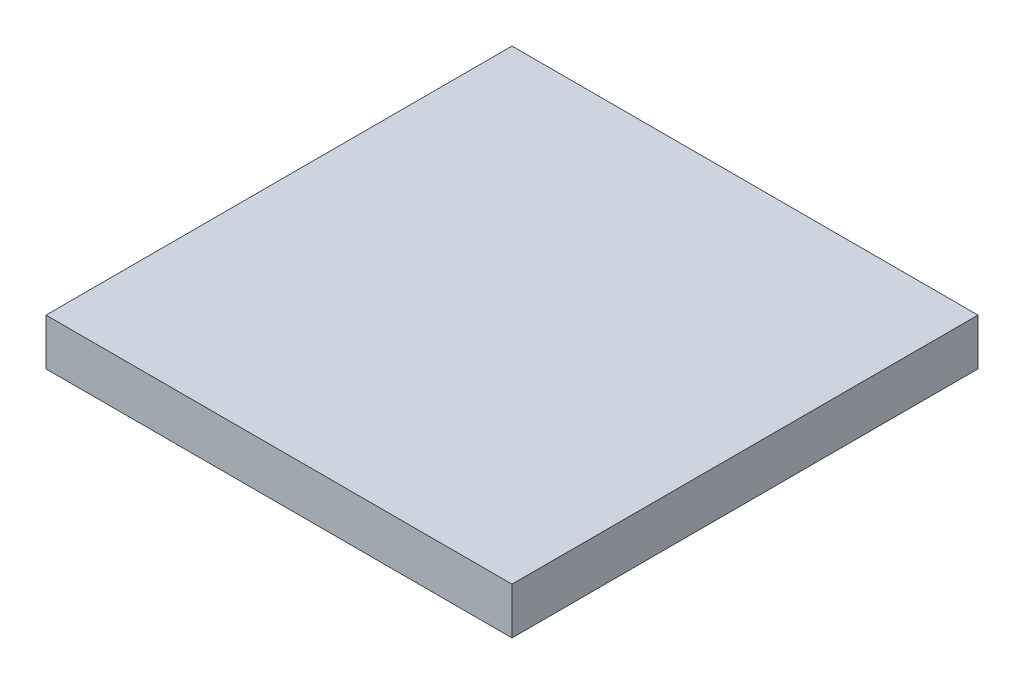
ISO-10303-21;
HEADER;
FILE_DESCRIPTION(('STEP AP214'),'2;1');
FILE_NAME('part.step','',(''),(''),'','','');
FILE_SCHEMA(('AUTOMOTIVE_DESIGN { 1 0 10303 214 1 1 1 1 }'));
ENDSEC;
DATA;
#1=APPLICATION_CONTEXT('core data for automotive mechanical design processes');
#2=APPLICATION_PROTOCOL_DEFINITION('international standard','automotive_design',2000,#1);
#3=PRODUCT_CONTEXT('',#1,'mechanical');
#4=PRODUCT('Part','Part','',(#3));
#5=PRODUCT_RELATED_PRODUCT_CATEGORY('part','',(#4));
#6=PRODUCT_DEFINITION_FORMATION('','',#4);
#7=PRODUCT_DEFINITION_CONTEXT('part definition',#1,'design');
#8=PRODUCT_DEFINITION('design','',#6,#7);
#9=PRODUCT_DEFINITION_SHAPE('','',#8);
#10=(LENGTH_UNIT() NAMED_UNIT(*) SI_UNIT(.MILLI.,.METRE.));
#11=(NAMED_UNIT(*) PLANE_ANGLE_UNIT() SI_UNIT($,.RADIAN.));
#12=(NAMED_UNIT(*) SI_UNIT($,.STERADIAN.) SOLID_ANGLE_UNIT());
#13=UNCERTAINTY_MEASURE_WITH_UNIT(LENGTH_MEASURE(1.E-05),#10,'distance_accuracy_value','');
#14=(GEOMETRIC_REPRESENTATION_CONTEXT(3) GLOBAL_UNCERTAINTY_ASSIGNED_CONTEXT((#13)) GLOBAL_UNIT_ASSIGNED_CONTEXT((#10,
#11,#12)) REPRESENTATION_CONTEXT('',''));
#15=CARTESIAN_POINT('',(0.,0.,0.));
#16=DIRECTION('',(0.,0.,1.));
#17=DIRECTION('',(1.,0.,0.));
#18=AXIS2_PLACEMENT_3D('',#15,#16,#17);
#19=CARTESIAN_POINT('',(250.,50.,-250.));
#20=DIRECTION('',(-1.,0.,0.));
#21=DIRECTION('',(0.,0.,1.));
#22=AXIS2_PLACEMENT_3D('',#19,#20,#21);
#23=PLANE('',#22);
#24=DIRECTION('',(0.,0.,-1.));
#25=VECTOR('',#24,1.);
#26=CARTESIAN_POINT('',(250.,0.,-250.));
#27=LINE('',#26,#25);
#28=CARTESIAN_POINT('',(250.,0.,250.));
#29=VERTEX_POINT('',#28);
#30=CARTESIAN_POINT('',(250.,0.,-250.));
#31=VERTEX_POINT('',#30);
#32=EDGE_CURVE('E102',#29,#31,#27,.T.);
#33=ORIENTED_EDGE('',*,*,#32,.T.);
#34=DIRECTION('',(0.,-1.,0.));
#35=VECTOR('',#34,1.);
#36=CARTESIAN_POINT('',(250.,50.,-250.));
#37=LINE('',#36,#35);
#38=CARTESIAN_POINT('',(250.,50.,-250.));
#39=VERTEX_POINT('',#38);
#40=EDGE_CURVE('E11',#39,#31,#37,.T.);
#41=ORIENTED_EDGE('',*,*,#40,.F.);
#42=DIRECTION('',(0.,0.,-1.));
#43=VECTOR('',#42,1.);
#44=CARTESIAN_POINT('',(250.,50.,-250.));
#45=LINE('',#44,#43);
#46=CARTESIAN_POINT('',(250.,50.,250.));
#47=VERTEX_POINT('',#46);
#48=EDGE_CURVE('E90',#47,#39,#45,.T.);
#49=ORIENTED_EDGE('',*,*,#48,.F.);
#50=DIRECTION('',(0.,-1.,0.));
#51=VECTOR('',#50,1.);
#52=CARTESIAN_POINT('',(250.,50.,250.));
#53=LINE('',#52,#51);
#54=EDGE_CURVE('E98',#47,#29,#53,.T.);
#55=ORIENTED_EDGE('',*,*,#54,.T.);
#56=EDGE_LOOP('',(#33,#41,#49,#55));
#57=FACE_BOUND('',#56,.T.);
#58=ADVANCED_FACE('F39',(#57),#23,.F.);
#59=CARTESIAN_POINT('',(-250.,50.,-250.));
#60=DIRECTION('',(0.,0.,1.));
#61=DIRECTION('',(1.,0.,0.));
#62=AXIS2_PLACEMENT_3D('',#59,#60,#61);
#63=PLANE('',#62);
#64=DIRECTION('',(-1.,0.,0.));
#65=VECTOR('',#64,1.);
#66=CARTESIAN_POINT('',(-250.,0.,-250.));
#67=LINE('',#66,#65);
#68=CARTESIAN_POINT('',(-250.,0.,-250.));
#69=VERTEX_POINT('',#68);
#70=EDGE_CURVE('E94',#31,#69,#67,.T.);
#71=ORIENTED_EDGE('',*,*,#70,.T.);
#72=DIRECTION('',(0.,-1.,0.));
#73=VECTOR('',#72,1.);
#74=CARTESIAN_POINT('',(-250.,50.,-250.));
#75=LINE('',#74,#73);
#76=CARTESIAN_POINT('',(-250.,50.,-250.));
#77=VERTEX_POINT('',#76);
#78=EDGE_CURVE('E47',#77,#69,#75,.T.);
#79=ORIENTED_EDGE('',*,*,#78,.F.);
#80=DIRECTION('',(-1.,0.,0.));
#81=VECTOR('',#80,1.);
#82=CARTESIAN_POINT('',(-250.,50.,-250.));
#83=LINE('',#82,#81);
#84=EDGE_CURVE('E85',#39,#77,#83,.T.);
#85=ORIENTED_EDGE('',*,*,#84,.F.);
#86=ORIENTED_EDGE('',*,*,#40,.T.);
#87=EDGE_LOOP('',(#71,#79,#85,#86));
#88=FACE_BOUND('',#87,.T.);
#89=ADVANCED_FACE('F93',(#88),#63,.F.);
#90=CARTESIAN_POINT('',(-250.,50.,-250.));
#91=DIRECTION('',(1.,0.,0.));
#92=DIRECTION('',(0.,0.,-1.));
#93=AXIS2_PLACEMENT_3D('',#90,#91,#92);
#94=PLANE('',#93);
#95=DIRECTION('',(0.,0.,1.));
#96=VECTOR('',#95,1.);
#97=CARTESIAN_POINT('',(-250.,0.,-250.));
#98=LINE('',#97,#96);
#99=CARTESIAN_POINT('',(-250.,0.,250.));
#100=VERTEX_POINT('',#99);
#101=EDGE_CURVE('E72',#69,#100,#98,.T.);
#102=ORIENTED_EDGE('',*,*,#101,.T.);
#103=DIRECTION('',(0.,-1.,0.));
#104=VECTOR('',#103,1.);
#105=CARTESIAN_POINT('',(-250.,50.,250.));
#106=LINE('',#105,#104);
#107=CARTESIAN_POINT('',(-250.,50.,250.));
#108=VERTEX_POINT('',#107);
#109=EDGE_CURVE('E95',#108,#100,#106,.T.);
#110=ORIENTED_EDGE('',*,*,#109,.F.);
#111=DIRECTION('',(0.,0.,1.));
#112=VECTOR('',#111,1.);
#113=CARTESIAN_POINT('',(-250.,50.,-250.));
#114=LINE('',#113,#112);
#115=EDGE_CURVE('E88',#77,#108,#114,.T.);
#116=ORIENTED_EDGE('',*,*,#115,.F.);
#117=ORIENTED_EDGE('',*,*,#78,.T.);
#118=EDGE_LOOP('',(#102,#110,#116,#117));
#119=FACE_BOUND('',#118,.T.);
#120=ADVANCED_FACE('F96',(#119),#94,.F.);
#121=CARTESIAN_POINT('',(-250.,50.,250.));
#122=DIRECTION('',(0.,0.,-1.));
#123=DIRECTION('',(-1.,0.,0.));
#124=AXIS2_PLACEMENT_3D('',#121,#122,#123);
#125=PLANE('',#124);
#126=DIRECTION('',(1.,0.,0.));
#127=VECTOR('',#126,1.);
#128=CARTESIAN_POINT('',(-250.,0.,250.));
#129=LINE('',#128,#127);
#130=EDGE_CURVE('E78',#100,#29,#129,.T.);
#131=ORIENTED_EDGE('',*,*,#130,.T.);
#132=ORIENTED_EDGE('',*,*,#54,.F.);
#133=DIRECTION('',(1.,0.,0.));
#134=VECTOR('',#133,1.);
#135=CARTESIAN_POINT('',(-250.,50.,250.));
#136=LINE('',#135,#134);
#137=EDGE_CURVE('E55',#108,#47,#136,.T.);
#138=ORIENTED_EDGE('',*,*,#137,.F.);
#139=ORIENTED_EDGE('',*,*,#109,.T.);
#140=EDGE_LOOP('',(#131,#132,#138,#139));
#141=FACE_BOUND('',#140,.T.);
#142=ADVANCED_FACE('F109',(#141),#125,.F.);
#143=CARTESIAN_POINT('',(0.,50.,0.));
#144=DIRECTION('',(0.,1.,0.));
#145=DIRECTION('',(0.,0.,1.));
#146=AXIS2_PLACEMENT_3D('',#143,#144,#145);
#147=PLANE('',#146);
#148=ORIENTED_EDGE('',*,*,#48,.T.);
#149=ORIENTED_EDGE('',*,*,#84,.T.);
#150=ORIENTED_EDGE('',*,*,#115,.T.);
#151=ORIENTED_EDGE('',*,*,#137,.T.);
#152=EDGE_LOOP('',(#148,#149,#150,#151));
#153=FACE_BOUND('',#152,.T.);
#154=ADVANCED_FACE('F86',(#153),#147,.T.);
#155=CARTESIAN_POINT('',(0.,0.,0.));
#156=DIRECTION('',(0.,1.,0.));
#157=DIRECTION('',(0.,0.,1.));
#158=AXIS2_PLACEMENT_3D('',#155,#156,#157);
#159=PLANE('',#158);
#160=ORIENTED_EDGE('',*,*,#32,.F.);
#161=ORIENTED_EDGE('',*,*,#130,.F.);
#162=ORIENTED_EDGE('',*,*,#101,.F.);
#163=ORIENTED_EDGE('',*,*,#70,.F.);
#164=EDGE_LOOP('',(#160,#161,#162,#163));
#165=FACE_BOUND('',#164,.T.);
#166=ADVANCED_FACE('F112',(#165),#159,.F.);
#167=CLOSED_SHELL('',(#58,#89,#120,#142,#154,#166));
#168=MANIFOLD_SOLID_BREP('B2',#167);
#169=ADVANCED_BREP_SHAPE_REPRESENTATION('',(#18,#168),#14);
#170=SHAPE_DEFINITION_REPRESENTATION(#9,#169);
ENDSEC;
END-ISO-10303-21;
